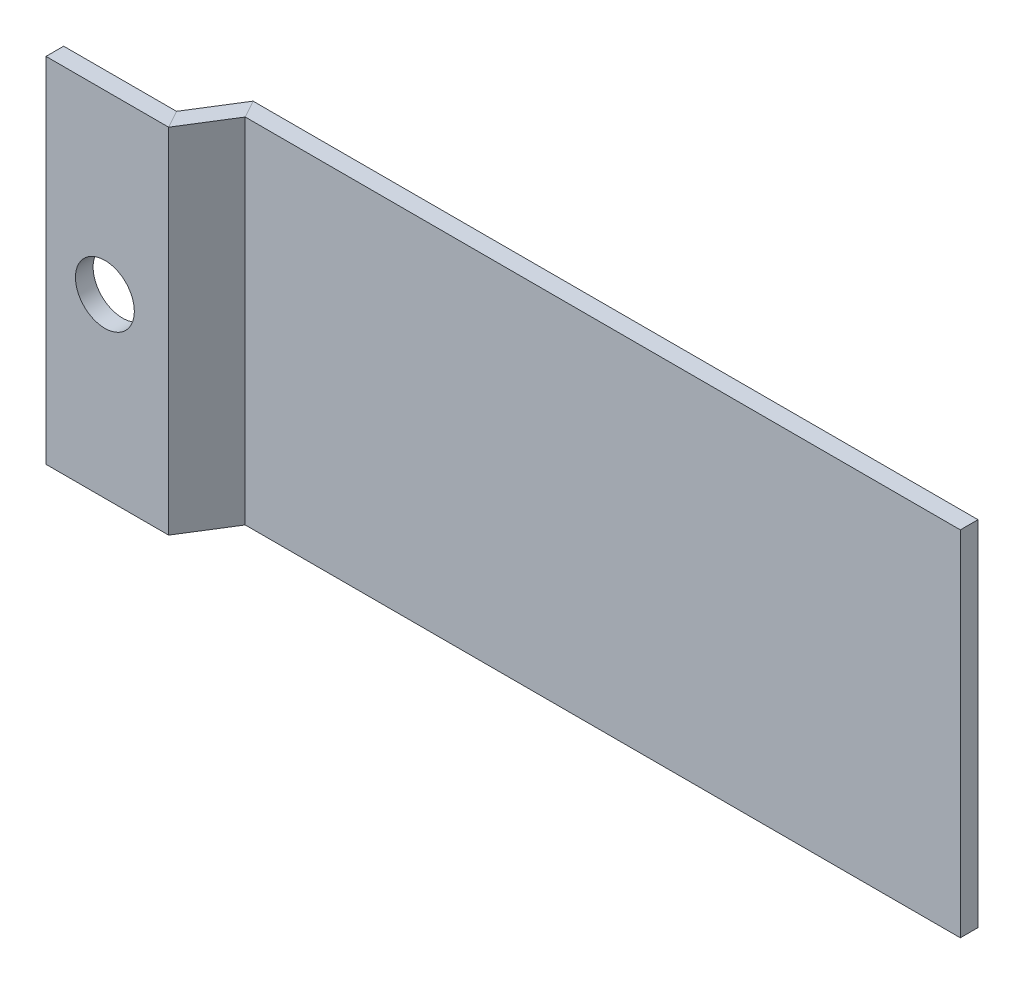
ISO-10303-21;
HEADER;
FILE_DESCRIPTION(('STEP AP214'),'2;1');
FILE_NAME('part.step','',(''),(''),'','','');
FILE_SCHEMA(('AUTOMOTIVE_DESIGN { 1 0 10303 214 1 1 1 1 }'));
ENDSEC;
DATA;
#1=APPLICATION_CONTEXT('core data for automotive mechanical design processes');
#2=APPLICATION_PROTOCOL_DEFINITION('international standard','automotive_design',2000,#1);
#3=PRODUCT_CONTEXT('',#1,'mechanical');
#4=PRODUCT('Part','Part','',(#3));
#5=PRODUCT_RELATED_PRODUCT_CATEGORY('part','',(#4));
#6=PRODUCT_DEFINITION_FORMATION('','',#4);
#7=PRODUCT_DEFINITION_CONTEXT('part definition',#1,'design');
#8=PRODUCT_DEFINITION('design','',#6,#7);
#9=PRODUCT_DEFINITION_SHAPE('','',#8);
#10=(LENGTH_UNIT() NAMED_UNIT(*) SI_UNIT(.MILLI.,.METRE.));
#11=(NAMED_UNIT(*) PLANE_ANGLE_UNIT() SI_UNIT($,.RADIAN.));
#12=(NAMED_UNIT(*) SI_UNIT($,.STERADIAN.) SOLID_ANGLE_UNIT());
#13=UNCERTAINTY_MEASURE_WITH_UNIT(LENGTH_MEASURE(1.E-05),#10,'distance_accuracy_value','');
#14=(GEOMETRIC_REPRESENTATION_CONTEXT(3) GLOBAL_UNCERTAINTY_ASSIGNED_CONTEXT((#13)) GLOBAL_UNIT_ASSIGNED_CONTEXT((#10,
#11,#12)) REPRESENTATION_CONTEXT('',''));
#15=CARTESIAN_POINT('',(0.,0.,0.));
#16=DIRECTION('',(0.,0.,1.));
#17=DIRECTION('',(1.,0.,0.));
#18=AXIS2_PLACEMENT_3D('',#15,#16,#17);
#19=CARTESIAN_POINT('',(29.4547366313103,0.,-1.6));
#20=DIRECTION('',(1.,0.,0.));
#21=DIRECTION('',(0.,0.,-1.));
#22=AXIS2_PLACEMENT_3D('',#19,#20,#21);
#23=PLANE('',#22);
#24=DIRECTION('',(0.,1.,0.));
#25=VECTOR('',#24,1.);
#26=CARTESIAN_POINT('',(29.4547366313103,6.,-1.9));
#27=LINE('',#26,#25);
#28=CARTESIAN_POINT('',(29.4547366313103,-6.,-1.9));
#29=VERTEX_POINT('',#28);
#30=CARTESIAN_POINT('',(29.4547366313103,6.,-1.9));
#31=VERTEX_POINT('',#30);
#32=EDGE_CURVE('E84',#29,#31,#27,.T.);
#33=ORIENTED_EDGE('',*,*,#32,.T.);
#34=DIRECTION('',(0.,0.,1.));
#35=VECTOR('',#34,1.);
#36=CARTESIAN_POINT('',(29.4547366313103,6.,-1.3));
#37=LINE('',#36,#35);
#38=CARTESIAN_POINT('',(29.4547366313103,6.,-1.3));
#39=VERTEX_POINT('',#38);
#40=EDGE_CURVE('E82',#31,#39,#37,.T.);
#41=ORIENTED_EDGE('',*,*,#40,.T.);
#42=DIRECTION('',(0.,-1.,0.));
#43=VECTOR('',#42,1.);
#44=CARTESIAN_POINT('',(29.4547366313103,6.,-1.3));
#45=LINE('',#44,#43);
#46=CARTESIAN_POINT('',(29.4547366313103,-6.,-1.3));
#47=VERTEX_POINT('',#46);
#48=EDGE_CURVE('E79',#39,#47,#45,.T.);
#49=ORIENTED_EDGE('',*,*,#48,.T.);
#50=DIRECTION('',(0.,0.,-1.));
#51=VECTOR('',#50,1.);
#52=CARTESIAN_POINT('',(29.4547366313103,-6.,-1.3));
#53=LINE('',#52,#51);
#54=EDGE_CURVE('E99',#47,#29,#53,.T.);
#55=ORIENTED_EDGE('',*,*,#54,.T.);
#56=EDGE_LOOP('',(#33,#41,#49,#55));
#57=FACE_BOUND('',#56,.T.);
#58=ADVANCED_FACE('F33',(#57),#23,.T.);
#59=CARTESIAN_POINT('',(0.,0.,0.));
#60=DIRECTION('',(1.,0.,0.));
#61=DIRECTION('',(0.,0.,-1.));
#62=AXIS2_PLACEMENT_3D('',#59,#60,#61);
#63=PLANE('',#62);
#64=DIRECTION('',(0.,1.,0.));
#65=VECTOR('',#64,1.);
#66=CARTESIAN_POINT('',(0.,6.,-0.299999999999999));
#67=LINE('',#66,#65);
#68=CARTESIAN_POINT('',(0.,-6.,-0.300000000000001));
#69=VERTEX_POINT('',#68);
#70=CARTESIAN_POINT('',(0.,6.,-0.299999999999999));
#71=VERTEX_POINT('',#70);
#72=EDGE_CURVE('E142',#69,#71,#67,.T.);
#73=ORIENTED_EDGE('',*,*,#72,.F.);
#74=DIRECTION('',(0.,0.,-1.));
#75=VECTOR('',#74,1.);
#76=CARTESIAN_POINT('',(0.,-6.,0.299999999999999));
#77=LINE('',#76,#75);
#78=CARTESIAN_POINT('',(0.,-6.,0.299999999999999));
#79=VERTEX_POINT('',#78);
#80=EDGE_CURVE('E148',#79,#69,#77,.T.);
#81=ORIENTED_EDGE('',*,*,#80,.F.);
#82=DIRECTION('',(0.,-1.,0.));
#83=VECTOR('',#82,1.);
#84=CARTESIAN_POINT('',(0.,6.,0.300000000000001));
#85=LINE('',#84,#83);
#86=CARTESIAN_POINT('',(0.,6.,0.300000000000001));
#87=VERTEX_POINT('',#86);
#88=EDGE_CURVE('E132',#87,#79,#85,.T.);
#89=ORIENTED_EDGE('',*,*,#88,.F.);
#90=DIRECTION('',(0.,0.,1.));
#91=VECTOR('',#90,1.);
#92=CARTESIAN_POINT('',(0.,6.,0.300000000000001));
#93=LINE('',#92,#91);
#94=EDGE_CURVE('E138',#71,#87,#93,.T.);
#95=ORIENTED_EDGE('',*,*,#94,.F.);
#96=EDGE_LOOP('',(#73,#81,#89,#95));
#97=FACE_BOUND('',#96,.T.);
#98=ADVANCED_FACE('F215',(#97),#63,.F.);
#99=CARTESIAN_POINT('',(4.71709827830266,6.,-1.3));
#100=DIRECTION('',(0.,0.,1.));
#101=DIRECTION('',(0.,-1.,0.));
#102=AXIS2_PLACEMENT_3D('',#99,#100,#101);
#103=PLANE('',#102);
#104=DIRECTION('',(0.,1.,0.));
#105=VECTOR('',#104,1.);
#106=CARTESIAN_POINT('',(5.16627429245212,6.,-1.3));
#107=LINE('',#106,#105);
#108=CARTESIAN_POINT('',(5.16627429245212,-6.,-1.3));
#109=VERTEX_POINT('',#108);
#110=CARTESIAN_POINT('',(5.16627429245212,6.,-1.3));
#111=VERTEX_POINT('',#110);
#112=EDGE_CURVE('E116',#109,#111,#107,.T.);
#113=ORIENTED_EDGE('',*,*,#112,.F.);
#114=DIRECTION('',(1.,0.,0.));
#115=VECTOR('',#114,1.);
#116=CARTESIAN_POINT('',(4.71709827830266,-6.,-1.3));
#117=LINE('',#116,#115);
#118=EDGE_CURVE('E97',#109,#47,#117,.T.);
#119=ORIENTED_EDGE('',*,*,#118,.T.);
#120=ORIENTED_EDGE('',*,*,#48,.F.);
#121=DIRECTION('',(1.,0.,0.));
#122=VECTOR('',#121,1.);
#123=CARTESIAN_POINT('',(4.71709827830266,6.,-1.3));
#124=LINE('',#123,#122);
#125=EDGE_CURVE('E94',#111,#39,#124,.T.);
#126=ORIENTED_EDGE('',*,*,#125,.F.);
#127=EDGE_LOOP('',(#113,#119,#120,#126));
#128=FACE_BOUND('',#127,.T.);
#129=ADVANCED_FACE('F93',(#128),#103,.T.);
#130=CARTESIAN_POINT('',(4.71709827830266,-6.,-1.3));
#131=DIRECTION('',(0.,-1.,0.));
#132=DIRECTION('',(0.,0.,-1.));
#133=AXIS2_PLACEMENT_3D('',#130,#131,#132);
#134=PLANE('',#133);
#135=DIRECTION('',(0.484768532392945,0.,0.874642481246818));
#136=VECTOR('',#135,1.);
#137=CARTESIAN_POINT('',(5.63707991334276,-6.,-0.450550068899794));
#138=LINE('',#137,#136);
#139=CARTESIAN_POINT('',(4.83372570754788,-6.,-1.9));
#140=VERTEX_POINT('',#139);
#141=EDGE_CURVE('E129',#140,#109,#138,.T.);
#142=ORIENTED_EDGE('',*,*,#141,.F.);
#143=DIRECTION('',(1.,0.,0.));
#144=VECTOR('',#143,1.);
#145=CARTESIAN_POINT('',(4.71709827830266,-6.,-1.9));
#146=LINE('',#145,#144);
#147=EDGE_CURVE('E108',#140,#29,#146,.T.);
#148=ORIENTED_EDGE('',*,*,#147,.T.);
#149=ORIENTED_EDGE('',*,*,#54,.F.);
#150=ORIENTED_EDGE('',*,*,#118,.F.);
#151=EDGE_LOOP('',(#142,#148,#149,#150));
#152=FACE_BOUND('',#151,.T.);
#153=ADVANCED_FACE('F207',(#152),#134,.T.);
#154=CARTESIAN_POINT('',(4.71709827830266,6.,-1.9));
#155=DIRECTION('',(0.,0.,-1.));
#156=DIRECTION('',(0.,1.,0.));
#157=AXIS2_PLACEMENT_3D('',#154,#155,#156);
#158=PLANE('',#157);
#159=DIRECTION('',(0.,-1.,0.));
#160=VECTOR('',#159,1.);
#161=CARTESIAN_POINT('',(4.83372570754788,6.,-1.9));
#162=LINE('',#161,#160);
#163=CARTESIAN_POINT('',(4.83372570754788,6.,-1.9));
#164=VERTEX_POINT('',#163);
#165=EDGE_CURVE('E126',#164,#140,#162,.T.);
#166=ORIENTED_EDGE('',*,*,#165,.F.);
#167=DIRECTION('',(1.,0.,0.));
#168=VECTOR('',#167,1.);
#169=CARTESIAN_POINT('',(4.71709827830266,6.,-1.9));
#170=LINE('',#169,#168);
#171=EDGE_CURVE('E98',#164,#31,#170,.T.);
#172=ORIENTED_EDGE('',*,*,#171,.T.);
#173=ORIENTED_EDGE('',*,*,#32,.F.);
#174=ORIENTED_EDGE('',*,*,#147,.F.);
#175=EDGE_LOOP('',(#166,#172,#173,#174));
#176=FACE_BOUND('',#175,.T.);
#177=ADVANCED_FACE('F225',(#176),#158,.T.);
#178=CARTESIAN_POINT('',(4.71709827830266,6.,-1.3));
#179=DIRECTION('',(0.,1.,0.));
#180=DIRECTION('',(0.,0.,1.));
#181=AXIS2_PLACEMENT_3D('',#178,#179,#180);
#182=PLANE('',#181);
#183=DIRECTION('',(-0.484768532392945,0.,-0.874642481246818));
#184=VECTOR('',#183,1.);
#185=CARTESIAN_POINT('',(5.63707991334276,6.,-0.450550068899793));
#186=LINE('',#185,#184);
#187=EDGE_CURVE('E103',#111,#164,#186,.T.);
#188=ORIENTED_EDGE('',*,*,#187,.F.);
#189=ORIENTED_EDGE('',*,*,#125,.T.);
#190=ORIENTED_EDGE('',*,*,#40,.F.);
#191=ORIENTED_EDGE('',*,*,#171,.F.);
#192=EDGE_LOOP('',(#188,#189,#190,#191));
#193=FACE_BOUND('',#192,.T.);
#194=ADVANCED_FACE('F101',(#193),#182,.T.);
#195=CARTESIAN_POINT('',(4.10446187857686,6.,0.398899862200414));
#196=DIRECTION('',(0.,1.,0.));
#197=DIRECTION('',(0.,0.,1.));
#198=AXIS2_PLACEMENT_3D('',#195,#196,#197);
#199=PLANE('',#198);
#200=DIRECTION('',(0.52999894000318,0.,-0.847998304005088));
#201=VECTOR('',#200,1.);
#202=CARTESIAN_POINT('',(4.10446187857686,6.,0.398899862200414));
#203=LINE('',#202,#201);
#204=CARTESIAN_POINT('',(4.16627429245212,6.,0.3));
#205=VERTEX_POINT('',#204);
#206=EDGE_CURVE('E118',#205,#111,#203,.T.);
#207=ORIENTED_EDGE('',*,*,#206,.T.);
#208=ORIENTED_EDGE('',*,*,#187,.T.);
#209=DIRECTION('',(0.52999894000318,0.,-0.847998304005088));
#210=VECTOR('',#209,1.);
#211=CARTESIAN_POINT('',(3.59566289617381,6.,0.0809004981985065));
#212=LINE('',#211,#210);
#213=CARTESIAN_POINT('',(3.83372570754788,6.,-0.299999999999999));
#214=VERTEX_POINT('',#213);
#215=EDGE_CURVE('E104',#214,#164,#212,.T.);
#216=ORIENTED_EDGE('',*,*,#215,.F.);
#217=DIRECTION('',(-0.484768532392945,0.,-0.874642481246818));
#218=VECTOR('',#217,1.);
#219=CARTESIAN_POINT('',(3.18719762560712,6.,-1.4664967670097));
#220=LINE('',#219,#218);
#221=EDGE_CURVE('E136',#205,#214,#220,.T.);
#222=ORIENTED_EDGE('',*,*,#221,.F.);
#223=EDGE_LOOP('',(#207,#208,#216,#222));
#224=FACE_BOUND('',#223,.T.);
#225=ADVANCED_FACE('F201',(#224),#199,.T.);
#226=CARTESIAN_POINT('',(3.59566289617381,6.,0.0809004981985065));
#227=DIRECTION('',(-0.847998304005088,0.,-0.52999894000318));
#228=DIRECTION('',(-0.52999894000318,0.,0.847998304005088));
#229=AXIS2_PLACEMENT_3D('',#226,#227,#228);
#230=PLANE('',#229);
#231=ORIENTED_EDGE('',*,*,#215,.T.);
#232=ORIENTED_EDGE('',*,*,#165,.T.);
#233=DIRECTION('',(0.52999894000318,0.,-0.847998304005088));
#234=VECTOR('',#233,1.);
#235=CARTESIAN_POINT('',(3.59566289617381,-6.,0.0809004981985058));
#236=LINE('',#235,#234);
#237=CARTESIAN_POINT('',(3.83372570754788,-6.,-0.3));
#238=VERTEX_POINT('',#237);
#239=EDGE_CURVE('E106',#238,#140,#236,.T.);
#240=ORIENTED_EDGE('',*,*,#239,.F.);
#241=DIRECTION('',(0.,-1.,0.));
#242=VECTOR('',#241,1.);
#243=CARTESIAN_POINT('',(3.83372570754788,6.,-0.299999999999999));
#244=LINE('',#243,#242);
#245=EDGE_CURVE('E42',#214,#238,#244,.T.);
#246=ORIENTED_EDGE('',*,*,#245,.F.);
#247=EDGE_LOOP('',(#231,#232,#240,#246));
#248=FACE_BOUND('',#247,.T.);
#249=ADVANCED_FACE('F211',(#248),#230,.T.);
#250=CARTESIAN_POINT('',(4.10446187857686,-6.,0.398899862200414));
#251=DIRECTION('',(0.,-1.,0.));
#252=DIRECTION('',(0.,0.,-1.));
#253=AXIS2_PLACEMENT_3D('',#250,#251,#252);
#254=PLANE('',#253);
#255=ORIENTED_EDGE('',*,*,#239,.T.);
#256=ORIENTED_EDGE('',*,*,#141,.T.);
#257=DIRECTION('',(0.52999894000318,0.,-0.847998304005088));
#258=VECTOR('',#257,1.);
#259=CARTESIAN_POINT('',(4.10446187857686,-6.,0.398899862200414));
#260=LINE('',#259,#258);
#261=CARTESIAN_POINT('',(4.16627429245212,-6.,0.299999999999999));
#262=VERTEX_POINT('',#261);
#263=EDGE_CURVE('E121',#262,#109,#260,.T.);
#264=ORIENTED_EDGE('',*,*,#263,.F.);
#265=DIRECTION('',(0.484768532392945,0.,0.874642481246818));
#266=VECTOR('',#265,1.);
#267=CARTESIAN_POINT('',(3.18719762560712,-6.,-1.4664967670097));
#268=LINE('',#267,#266);
#269=EDGE_CURVE('E11',#238,#262,#268,.T.);
#270=ORIENTED_EDGE('',*,*,#269,.F.);
#271=EDGE_LOOP('',(#255,#256,#264,#270));
#272=FACE_BOUND('',#271,.T.);
#273=ADVANCED_FACE('F209',(#272),#254,.T.);
#274=CARTESIAN_POINT('',(4.10446187857686,6.,0.398899862200414));
#275=DIRECTION('',(0.847998304005088,0.,0.52999894000318));
#276=DIRECTION('',(0.52999894000318,0.,-0.847998304005088));
#277=AXIS2_PLACEMENT_3D('',#274,#275,#276);
#278=PLANE('',#277);
#279=ORIENTED_EDGE('',*,*,#263,.T.);
#280=ORIENTED_EDGE('',*,*,#112,.T.);
#281=ORIENTED_EDGE('',*,*,#206,.F.);
#282=DIRECTION('',(0.,1.,0.));
#283=VECTOR('',#282,1.);
#284=CARTESIAN_POINT('',(4.16627429245212,6.,0.300000000000001));
#285=LINE('',#284,#283);
#286=EDGE_CURVE('E133',#262,#205,#285,.T.);
#287=ORIENTED_EDGE('',*,*,#286,.F.);
#288=EDGE_LOOP('',(#279,#280,#281,#287));
#289=FACE_BOUND('',#288,.T.);
#290=ADVANCED_FACE('F205',(#289),#278,.T.);
#291=CARTESIAN_POINT('',(0.,6.,0.300000000000001));
#292=DIRECTION('',(0.,1.,0.));
#293=DIRECTION('',(0.,0.,1.));
#294=AXIS2_PLACEMENT_3D('',#291,#292,#293);
#295=PLANE('',#294);
#296=DIRECTION('',(1.,0.,0.));
#297=VECTOR('',#296,1.);
#298=CARTESIAN_POINT('',(0.,6.,0.300000000000001));
#299=LINE('',#298,#297);
#300=EDGE_CURVE('E141',#87,#205,#299,.T.);
#301=ORIENTED_EDGE('',*,*,#300,.T.);
#302=ORIENTED_EDGE('',*,*,#221,.T.);
#303=DIRECTION('',(1.,0.,0.));
#304=VECTOR('',#303,1.);
#305=CARTESIAN_POINT('',(0.,6.,-0.299999999999999));
#306=LINE('',#305,#304);
#307=EDGE_CURVE('E137',#71,#214,#306,.T.);
#308=ORIENTED_EDGE('',*,*,#307,.F.);
#309=ORIENTED_EDGE('',*,*,#94,.T.);
#310=EDGE_LOOP('',(#301,#302,#308,#309));
#311=FACE_BOUND('',#310,.T.);
#312=ADVANCED_FACE('F214',(#311),#295,.T.);
#313=CARTESIAN_POINT('',(0.,6.,-0.299999999999999));
#314=DIRECTION('',(0.,0.,-1.));
#315=DIRECTION('',(0.,1.,0.));
#316=AXIS2_PLACEMENT_3D('',#313,#314,#315);
#317=PLANE('',#316);
#318=CARTESIAN_POINT('',(2.,0.,-0.3));
#319=DIRECTION('',(0.,0.,-1.));
#320=DIRECTION('',(0.,1.,0.));
#321=AXIS2_PLACEMENT_3D('',#318,#319,#320);
#322=CIRCLE('',#321,1.);
#323=CARTESIAN_POINT('',(2.,1.,-0.3));
#324=VERTEX_POINT('',#323);
#325=EDGE_CURVE('E164',#324,#324,#322,.T.);
#326=ORIENTED_EDGE('',*,*,#325,.F.);
#327=EDGE_LOOP('',(#326));
#328=FACE_BOUND('',#327,.T.);
#329=ORIENTED_EDGE('',*,*,#307,.T.);
#330=ORIENTED_EDGE('',*,*,#245,.T.);
#331=DIRECTION('',(1.,0.,0.));
#332=VECTOR('',#331,1.);
#333=CARTESIAN_POINT('',(0.,-6.,-0.300000000000001));
#334=LINE('',#333,#332);
#335=EDGE_CURVE('E145',#69,#238,#334,.T.);
#336=ORIENTED_EDGE('',*,*,#335,.F.);
#337=ORIENTED_EDGE('',*,*,#72,.T.);
#338=EDGE_LOOP('',(#329,#330,#336,#337));
#339=FACE_BOUND('',#338,.T.);
#340=ADVANCED_FACE('F213',(#328,#339),#317,.T.);
#341=CARTESIAN_POINT('',(0.,-6.,0.299999999999999));
#342=DIRECTION('',(0.,-1.,0.));
#343=DIRECTION('',(0.,0.,-1.));
#344=AXIS2_PLACEMENT_3D('',#341,#342,#343);
#345=PLANE('',#344);
#346=ORIENTED_EDGE('',*,*,#335,.T.);
#347=ORIENTED_EDGE('',*,*,#269,.T.);
#348=DIRECTION('',(1.,0.,0.));
#349=VECTOR('',#348,1.);
#350=CARTESIAN_POINT('',(0.,-6.,0.299999999999999));
#351=LINE('',#350,#349);
#352=EDGE_CURVE('E151',#79,#262,#351,.T.);
#353=ORIENTED_EDGE('',*,*,#352,.F.);
#354=ORIENTED_EDGE('',*,*,#80,.T.);
#355=EDGE_LOOP('',(#346,#347,#353,#354));
#356=FACE_BOUND('',#355,.T.);
#357=ADVANCED_FACE('F176',(#356),#345,.T.);
#358=CARTESIAN_POINT('',(0.,6.,0.300000000000001));
#359=DIRECTION('',(0.,0.,1.));
#360=DIRECTION('',(0.,-1.,0.));
#361=AXIS2_PLACEMENT_3D('',#358,#359,#360);
#362=PLANE('',#361);
#363=CARTESIAN_POINT('',(2.,0.,0.3));
#364=DIRECTION('',(0.,0.,1.));
#365=DIRECTION('',(0.,-1.,0.));
#366=AXIS2_PLACEMENT_3D('',#363,#364,#365);
#367=CIRCLE('',#366,1.);
#368=CARTESIAN_POINT('',(2.,-1.,0.3));
#369=VERTEX_POINT('',#368);
#370=EDGE_CURVE('E36',#369,#369,#367,.T.);
#371=ORIENTED_EDGE('',*,*,#370,.F.);
#372=EDGE_LOOP('',(#371));
#373=FACE_BOUND('',#372,.T.);
#374=ORIENTED_EDGE('',*,*,#352,.T.);
#375=ORIENTED_EDGE('',*,*,#286,.T.);
#376=ORIENTED_EDGE('',*,*,#300,.F.);
#377=ORIENTED_EDGE('',*,*,#88,.T.);
#378=EDGE_LOOP('',(#374,#375,#376,#377));
#379=FACE_BOUND('',#378,.T.);
#380=ADVANCED_FACE('F173',(#373,#379),#362,.T.);
#381=CARTESIAN_POINT('',(2.,0.,9.7));
#382=DIRECTION('',(0.,0.,-1.));
#383=DIRECTION('',(0.,1.,0.));
#384=AXIS2_PLACEMENT_3D('',#381,#382,#383);
#385=CYLINDRICAL_SURFACE('',#384,1.);
#386=ORIENTED_EDGE('',*,*,#370,.T.);
#387=EDGE_LOOP('',(#386));
#388=FACE_BOUND('',#387,.T.);
#389=ORIENTED_EDGE('',*,*,#325,.T.);
#390=EDGE_LOOP('',(#389));
#391=FACE_BOUND('',#390,.T.);
#392=ADVANCED_FACE('F171',(#388,#391),#385,.F.);
#393=CLOSED_SHELL('',(#58,#98,#129,#153,#177,#194,#225,#249,#273,#290,#312,#340,#357,#380,#392));
#394=MANIFOLD_SOLID_BREP('B2',#393);
#395=ADVANCED_BREP_SHAPE_REPRESENTATION('',(#18,#394),#14);
#396=SHAPE_DEFINITION_REPRESENTATION(#9,#395);
ENDSEC;
END-ISO-10303-21;
